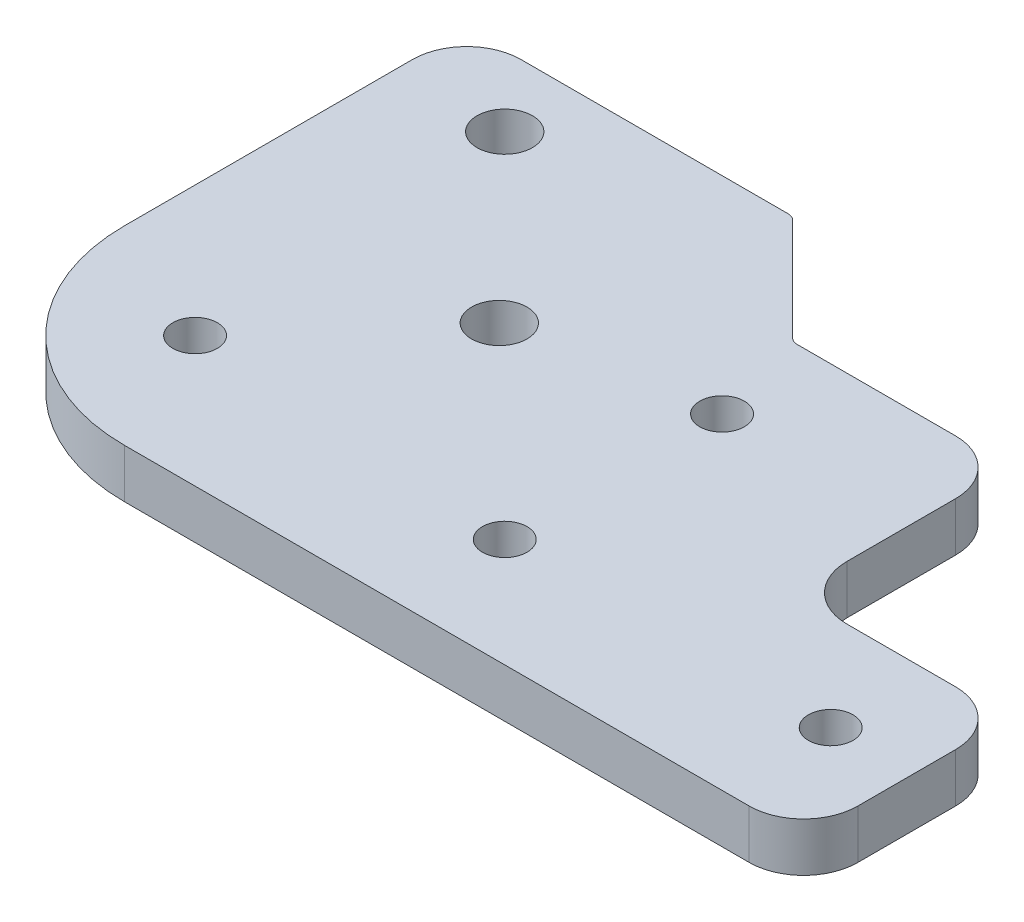
ISO-10303-21;
HEADER;
FILE_DESCRIPTION(('STEP AP214'),'2;1');
FILE_NAME('part.step','',(''),(''),'','','');
FILE_SCHEMA(('AUTOMOTIVE_DESIGN { 1 0 10303 214 1 1 1 1 }'));
ENDSEC;
DATA;
#1=APPLICATION_CONTEXT('core data for automotive mechanical design processes');
#2=APPLICATION_PROTOCOL_DEFINITION('international standard','automotive_design',2000,#1);
#3=PRODUCT_CONTEXT('',#1,'mechanical');
#4=PRODUCT('Part','Part','',(#3));
#5=PRODUCT_RELATED_PRODUCT_CATEGORY('part','',(#4));
#6=PRODUCT_DEFINITION_FORMATION('','',#4);
#7=PRODUCT_DEFINITION_CONTEXT('part definition',#1,'design');
#8=PRODUCT_DEFINITION('design','',#6,#7);
#9=PRODUCT_DEFINITION_SHAPE('','',#8);
#10=(LENGTH_UNIT() NAMED_UNIT(*) SI_UNIT(.MILLI.,.METRE.));
#11=(NAMED_UNIT(*) PLANE_ANGLE_UNIT() SI_UNIT($,.RADIAN.));
#12=(NAMED_UNIT(*) SI_UNIT($,.STERADIAN.) SOLID_ANGLE_UNIT());
#13=UNCERTAINTY_MEASURE_WITH_UNIT(LENGTH_MEASURE(1.E-05),#10,'distance_accuracy_value','');
#14=(GEOMETRIC_REPRESENTATION_CONTEXT(3) GLOBAL_UNCERTAINTY_ASSIGNED_CONTEXT((#13)) GLOBAL_UNIT_ASSIGNED_CONTEXT((#10,
#11,#12)) REPRESENTATION_CONTEXT('',''));
#15=CARTESIAN_POINT('',(0.,0.,0.));
#16=DIRECTION('',(0.,0.,1.));
#17=DIRECTION('',(1.,0.,0.));
#18=AXIS2_PLACEMENT_3D('',#15,#16,#17);
#19=CARTESIAN_POINT('',(0.,4.5,0.));
#20=DIRECTION('',(0.,-1.,0.));
#21=DIRECTION('',(0.,0.,-1.));
#22=AXIS2_PLACEMENT_3D('',#19,#20,#21);
#23=PLANE('',#22);
#24=CARTESIAN_POINT('',(25.,4.5,-27.));
#25=DIRECTION('',(0.,1.,0.));
#26=DIRECTION('',(0.,0.,1.));
#27=AXIS2_PLACEMENT_3D('',#24,#25,#26);
#28=CIRCLE('',#27,2.55);
#29=CARTESIAN_POINT('',(25.,4.5,-24.45));
#30=VERTEX_POINT('',#29);
#31=EDGE_CURVE('E548',#30,#30,#28,.T.);
#32=ORIENTED_EDGE('',*,*,#31,.F.);
#33=EDGE_LOOP('',(#32));
#34=FACE_BOUND('',#33,.T.);
#35=CARTESIAN_POINT('',(9.99999999999999,4.5,-42.5));
#36=DIRECTION('',(0.,1.,0.));
#37=DIRECTION('',(0.,0.,1.));
#38=AXIS2_PLACEMENT_3D('',#35,#36,#37);
#39=CIRCLE('',#38,2.55);
#40=CARTESIAN_POINT('',(9.99999999999999,4.5,-39.95));
#41=VERTEX_POINT('',#40);
#42=EDGE_CURVE('E554',#41,#41,#39,.T.);
#43=ORIENTED_EDGE('',*,*,#42,.F.);
#44=EDGE_LOOP('',(#43));
#45=FACE_BOUND('',#44,.T.);
#46=CARTESIAN_POINT('',(12.,4.5,-12.));
#47=DIRECTION('',(0.,1.,0.));
#48=DIRECTION('',(0.,0.,1.));
#49=AXIS2_PLACEMENT_3D('',#46,#47,#48);
#50=CIRCLE('',#49,2.05);
#51=CARTESIAN_POINT('',(12.,4.5,-9.95));
#52=VERTEX_POINT('',#51);
#53=EDGE_CURVE('E562',#52,#52,#50,.T.);
#54=ORIENTED_EDGE('',*,*,#53,.F.);
#55=EDGE_LOOP('',(#54));
#56=FACE_BOUND('',#55,.T.);
#57=DIRECTION('',(-0.707106781186548,0.,-0.707106781186548));
#58=VECTOR('',#57,1.);
#59=CARTESIAN_POINT('',(40.,4.5,-39.));
#60=LINE('',#59,#58);
#61=CARTESIAN_POINT('',(39.7071067811865,4.5,-39.2928932188134));
#62=VERTEX_POINT('',#61);
#63=CARTESIAN_POINT('',(30.2928932188134,4.5,-48.7071067811865));
#64=VERTEX_POINT('',#63);
#65=EDGE_CURVE('E264',#62,#64,#60,.T.);
#66=ORIENTED_EDGE('',*,*,#65,.T.);
#67=CARTESIAN_POINT('',(29.5857864376269,4.5,-48.));
#68=DIRECTION('',(0.,-1.,0.));
#69=DIRECTION('',(0.,0.,-1.));
#70=AXIS2_PLACEMENT_3D('',#67,#68,#69);
#71=CIRCLE('',#70,1.);
#72=CARTESIAN_POINT('',(29.5857864376269,4.5,-49.));
#73=VERTEX_POINT('',#72);
#74=EDGE_CURVE('E253',#64,#73,#71,.F.);
#75=ORIENTED_EDGE('',*,*,#74,.T.);
#76=DIRECTION('',(-1.,0.,0.));
#77=VECTOR('',#76,1.);
#78=CARTESIAN_POINT('',(0.,4.5,-49.));
#79=LINE('',#78,#77);
#80=CARTESIAN_POINT('',(4.99999999999999,4.5,-49.));
#81=VERTEX_POINT('',#80);
#82=EDGE_CURVE('E196',#73,#81,#79,.T.);
#83=ORIENTED_EDGE('',*,*,#82,.T.);
#84=CARTESIAN_POINT('',(4.99999999999999,4.5,-44.));
#85=DIRECTION('',(0.,-1.,0.));
#86=DIRECTION('',(0.,0.,-1.));
#87=AXIS2_PLACEMENT_3D('',#84,#85,#86);
#88=CIRCLE('',#87,5.);
#89=CARTESIAN_POINT('',(0.,4.5,-44.));
#90=VERTEX_POINT('',#89);
#91=EDGE_CURVE('E204',#81,#90,#88,.F.);
#92=ORIENTED_EDGE('',*,*,#91,.T.);
#93=DIRECTION('',(0.,0.,1.));
#94=VECTOR('',#93,1.);
#95=CARTESIAN_POINT('',(0.,4.5,0.));
#96=LINE('',#95,#94);
#97=CARTESIAN_POINT('',(0.,4.5,-17.5));
#98=VERTEX_POINT('',#97);
#99=EDGE_CURVE('E195',#90,#98,#96,.T.);
#100=ORIENTED_EDGE('',*,*,#99,.T.);
#101=CARTESIAN_POINT('',(17.5,4.5,-17.5));
#102=DIRECTION('',(0.,-1.,0.));
#103=DIRECTION('',(0.,0.,-1.));
#104=AXIS2_PLACEMENT_3D('',#101,#102,#103);
#105=CIRCLE('',#104,17.5);
#106=CARTESIAN_POINT('',(17.5,4.5,0.));
#107=VERTEX_POINT('',#106);
#108=EDGE_CURVE('E242',#98,#107,#105,.F.);
#109=ORIENTED_EDGE('',*,*,#108,.T.);
#110=DIRECTION('',(1.,0.,0.));
#111=VECTOR('',#110,1.);
#112=CARTESIAN_POINT('',(0.,4.5,0.));
#113=LINE('',#112,#111);
#114=CARTESIAN_POINT('',(75.,4.5,0.));
#115=VERTEX_POINT('',#114);
#116=EDGE_CURVE('E292',#107,#115,#113,.T.);
#117=ORIENTED_EDGE('',*,*,#116,.T.);
#118=CARTESIAN_POINT('',(75.,4.5,-5.));
#119=DIRECTION('',(0.,-1.,0.));
#120=DIRECTION('',(0.,0.,-1.));
#121=AXIS2_PLACEMENT_3D('',#118,#119,#120);
#122=CIRCLE('',#121,5.);
#123=CARTESIAN_POINT('',(80.,4.5,-5.));
#124=VERTEX_POINT('',#123);
#125=EDGE_CURVE('E210',#115,#124,#122,.F.);
#126=ORIENTED_EDGE('',*,*,#125,.T.);
#127=DIRECTION('',(0.,0.,-1.));
#128=VECTOR('',#127,1.);
#129=CARTESIAN_POINT('',(80.,4.5,0.));
#130=LINE('',#129,#128);
#131=CARTESIAN_POINT('',(80.,4.5,-14.));
#132=VERTEX_POINT('',#131);
#133=EDGE_CURVE('E169',#124,#132,#130,.T.);
#134=ORIENTED_EDGE('',*,*,#133,.T.);
#135=CARTESIAN_POINT('',(75.,4.5,-14.));
#136=DIRECTION('',(0.,-1.,0.));
#137=DIRECTION('',(0.,0.,-1.));
#138=AXIS2_PLACEMENT_3D('',#135,#136,#137);
#139=CIRCLE('',#138,5.);
#140=CARTESIAN_POINT('',(75.,4.5,-19.));
#141=VERTEX_POINT('',#140);
#142=EDGE_CURVE('E208',#132,#141,#139,.F.);
#143=ORIENTED_EDGE('',*,*,#142,.T.);
#144=DIRECTION('',(-1.,0.,0.));
#145=VECTOR('',#144,1.);
#146=CARTESIAN_POINT('',(80.,4.5,-19.));
#147=LINE('',#146,#145);
#148=CARTESIAN_POINT('',(65.,4.5,-19.));
#149=VERTEX_POINT('',#148);
#150=EDGE_CURVE('E295',#141,#149,#147,.T.);
#151=ORIENTED_EDGE('',*,*,#150,.T.);
#152=CARTESIAN_POINT('',(65.,4.5,-24.));
#153=DIRECTION('',(0.,-1.,0.));
#154=DIRECTION('',(0.,0.,-1.));
#155=AXIS2_PLACEMENT_3D('',#152,#153,#154);
#156=CIRCLE('',#155,5.);
#157=CARTESIAN_POINT('',(60.,4.5,-24.));
#158=VERTEX_POINT('',#157);
#159=EDGE_CURVE('E233',#149,#158,#156,.T.);
#160=ORIENTED_EDGE('',*,*,#159,.T.);
#161=DIRECTION('',(0.,0.,-1.));
#162=VECTOR('',#161,1.);
#163=CARTESIAN_POINT('',(60.,4.5,-19.));
#164=LINE('',#163,#162);
#165=CARTESIAN_POINT('',(60.,4.5,-34.));
#166=VERTEX_POINT('',#165);
#167=EDGE_CURVE('E270',#158,#166,#164,.T.);
#168=ORIENTED_EDGE('',*,*,#167,.T.);
#169=CARTESIAN_POINT('',(55.,4.5,-34.));
#170=DIRECTION('',(0.,-1.,0.));
#171=DIRECTION('',(0.,0.,-1.));
#172=AXIS2_PLACEMENT_3D('',#169,#170,#171);
#173=CIRCLE('',#172,5.);
#174=CARTESIAN_POINT('',(55.,4.5,-39.));
#175=VERTEX_POINT('',#174);
#176=EDGE_CURVE('E206',#166,#175,#173,.F.);
#177=ORIENTED_EDGE('',*,*,#176,.T.);
#178=DIRECTION('',(-1.,0.,0.));
#179=VECTOR('',#178,1.);
#180=CARTESIAN_POINT('',(60.,4.5,-39.));
#181=LINE('',#180,#179);
#182=CARTESIAN_POINT('',(40.4142135623731,4.5,-39.));
#183=VERTEX_POINT('',#182);
#184=EDGE_CURVE('E266',#175,#183,#181,.T.);
#185=ORIENTED_EDGE('',*,*,#184,.T.);
#186=CARTESIAN_POINT('',(40.4142135623731,4.5,-40.));
#187=DIRECTION('',(0.,-1.,0.));
#188=DIRECTION('',(0.,0.,-1.));
#189=AXIS2_PLACEMENT_3D('',#186,#187,#188);
#190=CIRCLE('',#189,1.);
#191=EDGE_CURVE('E11',#183,#62,#190,.T.);
#192=ORIENTED_EDGE('',*,*,#191,.T.);
#193=EDGE_LOOP('',(#66,#75,#83,#92,#100,#109,#117,#126,#134,#143,#151,#160,#168,#177,#185,#192));
#194=FACE_BOUND('',#193,.T.);
#195=CARTESIAN_POINT('',(72.5,4.5,-10.));
#196=DIRECTION('',(0.,1.,0.));
#197=DIRECTION('',(0.,0.,1.));
#198=AXIS2_PLACEMENT_3D('',#195,#196,#197);
#199=CIRCLE('',#198,2.04999999999999);
#200=CARTESIAN_POINT('',(72.5,4.5,-7.95000000000001));
#201=VERTEX_POINT('',#200);
#202=EDGE_CURVE('E274',#201,#201,#199,.T.);
#203=ORIENTED_EDGE('',*,*,#202,.F.);
#204=EDGE_LOOP('',(#203));
#205=FACE_BOUND('',#204,.T.);
#206=CARTESIAN_POINT('',(42.5,4.5,-10.));
#207=DIRECTION('',(0.,1.,0.));
#208=DIRECTION('',(0.,0.,1.));
#209=AXIS2_PLACEMENT_3D('',#206,#207,#208);
#210=CIRCLE('',#209,2.04999999999999);
#211=CARTESIAN_POINT('',(42.5,4.5,-7.95));
#212=VERTEX_POINT('',#211);
#213=EDGE_CURVE('E284',#212,#212,#210,.T.);
#214=ORIENTED_EDGE('',*,*,#213,.F.);
#215=EDGE_LOOP('',(#214));
#216=FACE_BOUND('',#215,.T.);
#217=CARTESIAN_POINT('',(42.5,4.5,-30.));
#218=DIRECTION('',(0.,1.,0.));
#219=DIRECTION('',(0.,0.,1.));
#220=AXIS2_PLACEMENT_3D('',#217,#218,#219);
#221=CIRCLE('',#220,2.05);
#222=CARTESIAN_POINT('',(42.5,4.5,-27.95));
#223=VERTEX_POINT('',#222);
#224=EDGE_CURVE('E565',#223,#223,#221,.T.);
#225=ORIENTED_EDGE('',*,*,#224,.F.);
#226=EDGE_LOOP('',(#225));
#227=FACE_BOUND('',#226,.T.);
#228=ADVANCED_FACE('F33',(#34,#45,#56,#194,#205,#216,#227),#23,.F.);
#229=CARTESIAN_POINT('',(0.,0.,0.));
#230=DIRECTION('',(0.,-1.,0.));
#231=DIRECTION('',(0.,0.,-1.));
#232=AXIS2_PLACEMENT_3D('',#229,#230,#231);
#233=PLANE('',#232);
#234=CARTESIAN_POINT('',(25.,0.,-27.));
#235=DIRECTION('',(0.,1.,0.));
#236=DIRECTION('',(0.,0.,1.));
#237=AXIS2_PLACEMENT_3D('',#234,#235,#236);
#238=CIRCLE('',#237,2.55);
#239=CARTESIAN_POINT('',(25.,0.,-24.45));
#240=VERTEX_POINT('',#239);
#241=EDGE_CURVE('E546',#240,#240,#238,.T.);
#242=ORIENTED_EDGE('',*,*,#241,.T.);
#243=EDGE_LOOP('',(#242));
#244=FACE_BOUND('',#243,.T.);
#245=CARTESIAN_POINT('',(9.99999999999999,0.,-42.5));
#246=DIRECTION('',(0.,1.,0.));
#247=DIRECTION('',(0.,0.,1.));
#248=AXIS2_PLACEMENT_3D('',#245,#246,#247);
#249=CIRCLE('',#248,2.55);
#250=CARTESIAN_POINT('',(9.99999999999999,0.,-39.95));
#251=VERTEX_POINT('',#250);
#252=EDGE_CURVE('E549',#251,#251,#249,.T.);
#253=ORIENTED_EDGE('',*,*,#252,.T.);
#254=EDGE_LOOP('',(#253));
#255=FACE_BOUND('',#254,.T.);
#256=CARTESIAN_POINT('',(12.,0.,-12.));
#257=DIRECTION('',(0.,1.,0.));
#258=DIRECTION('',(0.,0.,1.));
#259=AXIS2_PLACEMENT_3D('',#256,#257,#258);
#260=CIRCLE('',#259,2.05);
#261=CARTESIAN_POINT('',(12.,0.,-9.95));
#262=VERTEX_POINT('',#261);
#263=EDGE_CURVE('E559',#262,#262,#260,.T.);
#264=ORIENTED_EDGE('',*,*,#263,.T.);
#265=EDGE_LOOP('',(#264));
#266=FACE_BOUND('',#265,.T.);
#267=CARTESIAN_POINT('',(42.5,0.,-10.));
#268=DIRECTION('',(0.,1.,0.));
#269=DIRECTION('',(0.,0.,1.));
#270=AXIS2_PLACEMENT_3D('',#267,#268,#269);
#271=CIRCLE('',#270,2.04999999999999);
#272=CARTESIAN_POINT('',(42.5,0.,-7.95));
#273=VERTEX_POINT('',#272);
#274=EDGE_CURVE('E287',#273,#273,#271,.T.);
#275=ORIENTED_EDGE('',*,*,#274,.T.);
#276=EDGE_LOOP('',(#275));
#277=FACE_BOUND('',#276,.T.);
#278=DIRECTION('',(-1.,0.,0.));
#279=VECTOR('',#278,1.);
#280=CARTESIAN_POINT('',(0.,0.,-49.));
#281=LINE('',#280,#279);
#282=CARTESIAN_POINT('',(29.5857864376269,0.,-49.));
#283=VERTEX_POINT('',#282);
#284=CARTESIAN_POINT('',(4.99999999999999,0.,-49.));
#285=VERTEX_POINT('',#284);
#286=EDGE_CURVE('E193',#283,#285,#281,.T.);
#287=ORIENTED_EDGE('',*,*,#286,.F.);
#288=CARTESIAN_POINT('',(29.5857864376269,0.,-48.));
#289=DIRECTION('',(0.,-1.,0.));
#290=DIRECTION('',(0.,0.,-1.));
#291=AXIS2_PLACEMENT_3D('',#288,#289,#290);
#292=CIRCLE('',#291,1.);
#293=CARTESIAN_POINT('',(30.2928932188134,0.,-48.7071067811865));
#294=VERTEX_POINT('',#293);
#295=EDGE_CURVE('E247',#283,#294,#292,.T.);
#296=ORIENTED_EDGE('',*,*,#295,.T.);
#297=DIRECTION('',(-0.707106781186548,0.,-0.707106781186548));
#298=VECTOR('',#297,1.);
#299=CARTESIAN_POINT('',(40.,0.,-39.));
#300=LINE('',#299,#298);
#301=CARTESIAN_POINT('',(39.7071067811865,0.,-39.2928932188134));
#302=VERTEX_POINT('',#301);
#303=EDGE_CURVE('E191',#302,#294,#300,.T.);
#304=ORIENTED_EDGE('',*,*,#303,.F.);
#305=CARTESIAN_POINT('',(40.4142135623731,0.,-40.));
#306=DIRECTION('',(0.,-1.,0.));
#307=DIRECTION('',(0.,0.,-1.));
#308=AXIS2_PLACEMENT_3D('',#305,#306,#307);
#309=CIRCLE('',#308,1.);
#310=CARTESIAN_POINT('',(40.4142135623731,0.,-39.));
#311=VERTEX_POINT('',#310);
#312=EDGE_CURVE('E41',#302,#311,#309,.F.);
#313=ORIENTED_EDGE('',*,*,#312,.T.);
#314=DIRECTION('',(-1.,0.,0.));
#315=VECTOR('',#314,1.);
#316=CARTESIAN_POINT('',(60.,0.,-39.));
#317=LINE('',#316,#315);
#318=CARTESIAN_POINT('',(55.,0.,-39.));
#319=VERTEX_POINT('',#318);
#320=EDGE_CURVE('E189',#319,#311,#317,.T.);
#321=ORIENTED_EDGE('',*,*,#320,.F.);
#322=CARTESIAN_POINT('',(55.,0.,-34.));
#323=DIRECTION('',(0.,-1.,0.));
#324=DIRECTION('',(0.,0.,-1.));
#325=AXIS2_PLACEMENT_3D('',#322,#323,#324);
#326=CIRCLE('',#325,5.);
#327=CARTESIAN_POINT('',(60.,0.,-34.));
#328=VERTEX_POINT('',#327);
#329=EDGE_CURVE('E200',#319,#328,#326,.T.);
#330=ORIENTED_EDGE('',*,*,#329,.T.);
#331=DIRECTION('',(0.,0.,-1.));
#332=VECTOR('',#331,1.);
#333=CARTESIAN_POINT('',(60.,0.,-19.));
#334=LINE('',#333,#332);
#335=CARTESIAN_POINT('',(60.,0.,-24.));
#336=VERTEX_POINT('',#335);
#337=EDGE_CURVE('E181',#336,#328,#334,.T.);
#338=ORIENTED_EDGE('',*,*,#337,.F.);
#339=CARTESIAN_POINT('',(65.,0.,-24.));
#340=DIRECTION('',(0.,-1.,0.));
#341=DIRECTION('',(0.,0.,-1.));
#342=AXIS2_PLACEMENT_3D('',#339,#340,#341);
#343=CIRCLE('',#342,5.);
#344=CARTESIAN_POINT('',(65.,0.,-19.));
#345=VERTEX_POINT('',#344);
#346=EDGE_CURVE('E231',#336,#345,#343,.F.);
#347=ORIENTED_EDGE('',*,*,#346,.T.);
#348=DIRECTION('',(-1.,0.,0.));
#349=VECTOR('',#348,1.);
#350=CARTESIAN_POINT('',(80.,0.,-19.));
#351=LINE('',#350,#349);
#352=CARTESIAN_POINT('',(75.,0.,-19.));
#353=VERTEX_POINT('',#352);
#354=EDGE_CURVE('E177',#353,#345,#351,.T.);
#355=ORIENTED_EDGE('',*,*,#354,.F.);
#356=CARTESIAN_POINT('',(75.,0.,-14.));
#357=DIRECTION('',(0.,-1.,0.));
#358=DIRECTION('',(0.,0.,-1.));
#359=AXIS2_PLACEMENT_3D('',#356,#357,#358);
#360=CIRCLE('',#359,5.);
#361=CARTESIAN_POINT('',(80.,0.,-14.));
#362=VERTEX_POINT('',#361);
#363=EDGE_CURVE('E160',#353,#362,#360,.T.);
#364=ORIENTED_EDGE('',*,*,#363,.T.);
#365=DIRECTION('',(0.,0.,-1.));
#366=VECTOR('',#365,1.);
#367=CARTESIAN_POINT('',(80.,0.,0.));
#368=LINE('',#367,#366);
#369=CARTESIAN_POINT('',(80.,0.,-5.));
#370=VERTEX_POINT('',#369);
#371=EDGE_CURVE('E166',#370,#362,#368,.T.);
#372=ORIENTED_EDGE('',*,*,#371,.F.);
#373=CARTESIAN_POINT('',(75.,0.,-5.));
#374=DIRECTION('',(0.,-1.,0.));
#375=DIRECTION('',(0.,0.,-1.));
#376=AXIS2_PLACEMENT_3D('',#373,#374,#375);
#377=CIRCLE('',#376,5.);
#378=CARTESIAN_POINT('',(75.,0.,0.));
#379=VERTEX_POINT('',#378);
#380=EDGE_CURVE('E150',#370,#379,#377,.T.);
#381=ORIENTED_EDGE('',*,*,#380,.T.);
#382=DIRECTION('',(1.,0.,0.));
#383=VECTOR('',#382,1.);
#384=CARTESIAN_POINT('',(0.,0.,0.));
#385=LINE('',#384,#383);
#386=CARTESIAN_POINT('',(17.5,0.,0.));
#387=VERTEX_POINT('',#386);
#388=EDGE_CURVE('E178',#387,#379,#385,.T.);
#389=ORIENTED_EDGE('',*,*,#388,.F.);
#390=CARTESIAN_POINT('',(17.5,0.,-17.5));
#391=DIRECTION('',(0.,-1.,0.));
#392=DIRECTION('',(0.,0.,-1.));
#393=AXIS2_PLACEMENT_3D('',#390,#391,#392);
#394=CIRCLE('',#393,17.5);
#395=CARTESIAN_POINT('',(0.,0.,-17.5));
#396=VERTEX_POINT('',#395);
#397=EDGE_CURVE('E238',#387,#396,#394,.T.);
#398=ORIENTED_EDGE('',*,*,#397,.T.);
#399=DIRECTION('',(0.,0.,1.));
#400=VECTOR('',#399,1.);
#401=CARTESIAN_POINT('',(0.,0.,0.));
#402=LINE('',#401,#400);
#403=CARTESIAN_POINT('',(0.,0.,-44.));
#404=VERTEX_POINT('',#403);
#405=EDGE_CURVE('E183',#404,#396,#402,.T.);
#406=ORIENTED_EDGE('',*,*,#405,.F.);
#407=CARTESIAN_POINT('',(4.99999999999999,0.,-44.));
#408=DIRECTION('',(0.,-1.,0.));
#409=DIRECTION('',(0.,0.,-1.));
#410=AXIS2_PLACEMENT_3D('',#407,#408,#409);
#411=CIRCLE('',#410,5.);
#412=EDGE_CURVE('E170',#404,#285,#411,.T.);
#413=ORIENTED_EDGE('',*,*,#412,.T.);
#414=EDGE_LOOP('',(#287,#296,#304,#313,#321,#330,#338,#347,#355,#364,#372,#381,#389,#398,#406,#413));
#415=FACE_BOUND('',#414,.T.);
#416=CARTESIAN_POINT('',(72.5,0.,-10.));
#417=DIRECTION('',(0.,1.,0.));
#418=DIRECTION('',(0.,0.,1.));
#419=AXIS2_PLACEMENT_3D('',#416,#417,#418);
#420=CIRCLE('',#419,2.04999999999999);
#421=CARTESIAN_POINT('',(72.5,0.,-7.95000000000001));
#422=VERTEX_POINT('',#421);
#423=EDGE_CURVE('E279',#422,#422,#420,.T.);
#424=ORIENTED_EDGE('',*,*,#423,.T.);
#425=EDGE_LOOP('',(#424));
#426=FACE_BOUND('',#425,.T.);
#427=CARTESIAN_POINT('',(42.5,0.,-30.));
#428=DIRECTION('',(0.,1.,0.));
#429=DIRECTION('',(0.,0.,1.));
#430=AXIS2_PLACEMENT_3D('',#427,#428,#429);
#431=CIRCLE('',#430,2.05);
#432=CARTESIAN_POINT('',(42.5,0.,-27.95));
#433=VERTEX_POINT('',#432);
#434=EDGE_CURVE('E551',#433,#433,#431,.T.);
#435=ORIENTED_EDGE('',*,*,#434,.T.);
#436=EDGE_LOOP('',(#435));
#437=FACE_BOUND('',#436,.T.);
#438=ADVANCED_FACE('F174',(#244,#255,#266,#277,#415,#426,#437),#233,.T.);
#439=CARTESIAN_POINT('',(0.,4.5,0.));
#440=DIRECTION('',(1.,0.,0.));
#441=DIRECTION('',(0.,0.,-1.));
#442=AXIS2_PLACEMENT_3D('',#439,#440,#441);
#443=PLANE('',#442);
#444=ORIENTED_EDGE('',*,*,#405,.T.);
#445=DIRECTION('',(0.,-1.,0.));
#446=VECTOR('',#445,1.);
#447=CARTESIAN_POINT('',(0.,4.5,-17.5));
#448=LINE('',#447,#446);
#449=EDGE_CURVE('E240',#396,#98,#448,.F.);
#450=ORIENTED_EDGE('',*,*,#449,.T.);
#451=ORIENTED_EDGE('',*,*,#99,.F.);
#452=DIRECTION('',(0.,-1.,0.));
#453=VECTOR('',#452,1.);
#454=CARTESIAN_POINT('',(0.,4.5,-44.));
#455=LINE('',#454,#453);
#456=EDGE_CURVE('E225',#90,#404,#455,.T.);
#457=ORIENTED_EDGE('',*,*,#456,.T.);
#458=EDGE_LOOP('',(#444,#450,#451,#457));
#459=FACE_BOUND('',#458,.T.);
#460=ADVANCED_FACE('F326',(#459),#443,.F.);
#461=CARTESIAN_POINT('',(0.,4.5,0.));
#462=DIRECTION('',(0.,0.,-1.));
#463=DIRECTION('',(-1.,0.,0.));
#464=AXIS2_PLACEMENT_3D('',#461,#462,#463);
#465=PLANE('',#464);
#466=ORIENTED_EDGE('',*,*,#116,.F.);
#467=DIRECTION('',(0.,-1.,0.));
#468=VECTOR('',#467,1.);
#469=CARTESIAN_POINT('',(17.5,4.5,0.));
#470=LINE('',#469,#468);
#471=EDGE_CURVE('E235',#107,#387,#470,.T.);
#472=ORIENTED_EDGE('',*,*,#471,.T.);
#473=ORIENTED_EDGE('',*,*,#388,.T.);
#474=DIRECTION('',(0.,-1.,0.));
#475=VECTOR('',#474,1.);
#476=CARTESIAN_POINT('',(75.,4.5,0.));
#477=LINE('',#476,#475);
#478=EDGE_CURVE('E156',#379,#115,#477,.F.);
#479=ORIENTED_EDGE('',*,*,#478,.T.);
#480=EDGE_LOOP('',(#466,#472,#473,#479));
#481=FACE_BOUND('',#480,.T.);
#482=ADVANCED_FACE('F322',(#481),#465,.F.);
#483=CARTESIAN_POINT('',(80.,4.5,0.));
#484=DIRECTION('',(-1.,0.,0.));
#485=DIRECTION('',(0.,0.,1.));
#486=AXIS2_PLACEMENT_3D('',#483,#484,#485);
#487=PLANE('',#486);
#488=ORIENTED_EDGE('',*,*,#133,.F.);
#489=DIRECTION('',(0.,-1.,0.));
#490=VECTOR('',#489,1.);
#491=CARTESIAN_POINT('',(80.,4.5,-5.));
#492=LINE('',#491,#490);
#493=EDGE_CURVE('E154',#124,#370,#492,.T.);
#494=ORIENTED_EDGE('',*,*,#493,.T.);
#495=ORIENTED_EDGE('',*,*,#371,.T.);
#496=DIRECTION('',(0.,-1.,0.));
#497=VECTOR('',#496,1.);
#498=CARTESIAN_POINT('',(80.,4.5,-14.));
#499=LINE('',#498,#497);
#500=EDGE_CURVE('E171',#362,#132,#499,.F.);
#501=ORIENTED_EDGE('',*,*,#500,.T.);
#502=EDGE_LOOP('',(#488,#494,#495,#501));
#503=FACE_BOUND('',#502,.T.);
#504=ADVANCED_FACE('F165',(#503),#487,.F.);
#505=CARTESIAN_POINT('',(80.,4.5,-19.));
#506=DIRECTION('',(0.,0.,1.));
#507=DIRECTION('',(1.,0.,0.));
#508=AXIS2_PLACEMENT_3D('',#505,#506,#507);
#509=PLANE('',#508);
#510=ORIENTED_EDGE('',*,*,#150,.F.);
#511=DIRECTION('',(0.,-1.,0.));
#512=VECTOR('',#511,1.);
#513=CARTESIAN_POINT('',(75.,4.5,-19.));
#514=LINE('',#513,#512);
#515=EDGE_CURVE('E214',#141,#353,#514,.T.);
#516=ORIENTED_EDGE('',*,*,#515,.T.);
#517=ORIENTED_EDGE('',*,*,#354,.T.);
#518=DIRECTION('',(0.,-1.,0.));
#519=VECTOR('',#518,1.);
#520=CARTESIAN_POINT('',(65.,4.5,-19.));
#521=LINE('',#520,#519);
#522=EDGE_CURVE('E212',#345,#149,#521,.F.);
#523=ORIENTED_EDGE('',*,*,#522,.T.);
#524=EDGE_LOOP('',(#510,#516,#517,#523));
#525=FACE_BOUND('',#524,.T.);
#526=ADVANCED_FACE('F313',(#525),#509,.F.);
#527=CARTESIAN_POINT('',(60.,4.5,-19.));
#528=DIRECTION('',(-1.,0.,0.));
#529=DIRECTION('',(0.,0.,1.));
#530=AXIS2_PLACEMENT_3D('',#527,#528,#529);
#531=PLANE('',#530);
#532=ORIENTED_EDGE('',*,*,#167,.F.);
#533=DIRECTION('',(0.,-1.,0.));
#534=VECTOR('',#533,1.);
#535=CARTESIAN_POINT('',(60.,0.,-24.));
#536=LINE('',#535,#534);
#537=EDGE_CURVE('E219',#158,#336,#536,.T.);
#538=ORIENTED_EDGE('',*,*,#537,.T.);
#539=ORIENTED_EDGE('',*,*,#337,.T.);
#540=DIRECTION('',(0.,-1.,0.));
#541=VECTOR('',#540,1.);
#542=CARTESIAN_POINT('',(60.,4.5,-34.));
#543=LINE('',#542,#541);
#544=EDGE_CURVE('E217',#328,#166,#543,.F.);
#545=ORIENTED_EDGE('',*,*,#544,.T.);
#546=EDGE_LOOP('',(#532,#538,#539,#545));
#547=FACE_BOUND('',#546,.T.);
#548=ADVANCED_FACE('F307',(#547),#531,.F.);
#549=CARTESIAN_POINT('',(60.,4.5,-39.));
#550=DIRECTION('',(0.,0.,1.));
#551=DIRECTION('',(1.,0.,0.));
#552=AXIS2_PLACEMENT_3D('',#549,#550,#551);
#553=PLANE('',#552);
#554=ORIENTED_EDGE('',*,*,#320,.T.);
#555=DIRECTION('',(0.,-1.,0.));
#556=VECTOR('',#555,1.);
#557=CARTESIAN_POINT('',(40.4142135623731,4.5,-39.));
#558=LINE('',#557,#556);
#559=EDGE_CURVE('E48',#311,#183,#558,.F.);
#560=ORIENTED_EDGE('',*,*,#559,.T.);
#561=ORIENTED_EDGE('',*,*,#184,.F.);
#562=DIRECTION('',(0.,-1.,0.));
#563=VECTOR('',#562,1.);
#564=CARTESIAN_POINT('',(55.,4.5,-39.));
#565=LINE('',#564,#563);
#566=EDGE_CURVE('E222',#175,#319,#565,.T.);
#567=ORIENTED_EDGE('',*,*,#566,.T.);
#568=EDGE_LOOP('',(#554,#560,#561,#567));
#569=FACE_BOUND('',#568,.T.);
#570=ADVANCED_FACE('F259',(#569),#553,.F.);
#571=CARTESIAN_POINT('',(40.,4.5,-39.));
#572=DIRECTION('',(-0.707106781186547,0.,0.707106781186547));
#573=DIRECTION('',(0.707106781186548,0.,0.707106781186548));
#574=AXIS2_PLACEMENT_3D('',#571,#572,#573);
#575=PLANE('',#574);
#576=ORIENTED_EDGE('',*,*,#303,.T.);
#577=DIRECTION('',(0.,-1.,0.));
#578=VECTOR('',#577,1.);
#579=CARTESIAN_POINT('',(30.2928932188134,4.5,-48.7071067811865));
#580=LINE('',#579,#578);
#581=EDGE_CURVE('E56',#294,#64,#580,.F.);
#582=ORIENTED_EDGE('',*,*,#581,.T.);
#583=ORIENTED_EDGE('',*,*,#65,.F.);
#584=DIRECTION('',(0.,-1.,0.));
#585=VECTOR('',#584,1.);
#586=CARTESIAN_POINT('',(39.7071067811865,0.,-39.2928932188134));
#587=LINE('',#586,#585);
#588=EDGE_CURVE('E249',#62,#302,#587,.T.);
#589=ORIENTED_EDGE('',*,*,#588,.T.);
#590=EDGE_LOOP('',(#576,#582,#583,#589));
#591=FACE_BOUND('',#590,.T.);
#592=ADVANCED_FACE('F267',(#591),#575,.F.);
#593=CARTESIAN_POINT('',(0.,4.5,-49.));
#594=DIRECTION('',(0.,0.,1.));
#595=DIRECTION('',(1.,0.,0.));
#596=AXIS2_PLACEMENT_3D('',#593,#594,#595);
#597=PLANE('',#596);
#598=ORIENTED_EDGE('',*,*,#82,.F.);
#599=DIRECTION('',(0.,-1.,0.));
#600=VECTOR('',#599,1.);
#601=CARTESIAN_POINT('',(29.5857864376269,4.5,-49.));
#602=LINE('',#601,#600);
#603=EDGE_CURVE('E244',#73,#283,#602,.T.);
#604=ORIENTED_EDGE('',*,*,#603,.T.);
#605=ORIENTED_EDGE('',*,*,#286,.T.);
#606=DIRECTION('',(0.,-1.,0.));
#607=VECTOR('',#606,1.);
#608=CARTESIAN_POINT('',(4.99999999999999,4.5,-49.));
#609=LINE('',#608,#607);
#610=EDGE_CURVE('E228',#285,#81,#609,.F.);
#611=ORIENTED_EDGE('',*,*,#610,.T.);
#612=EDGE_LOOP('',(#598,#604,#605,#611));
#613=FACE_BOUND('',#612,.T.);
#614=ADVANCED_FACE('F334',(#613),#597,.F.);
#615=CARTESIAN_POINT('',(72.5,4.5,-10.));
#616=DIRECTION('',(0.,-1.,0.));
#617=DIRECTION('',(0.,0.,-1.));
#618=AXIS2_PLACEMENT_3D('',#615,#616,#617);
#619=CYLINDRICAL_SURFACE('',#618,2.04999999999999);
#620=ORIENTED_EDGE('',*,*,#202,.T.);
#621=EDGE_LOOP('',(#620));
#622=FACE_BOUND('',#621,.T.);
#623=ORIENTED_EDGE('',*,*,#423,.F.);
#624=EDGE_LOOP('',(#623));
#625=FACE_BOUND('',#624,.T.);
#626=ADVANCED_FACE('F356',(#622,#625),#619,.F.);
#627=CARTESIAN_POINT('',(42.5,4.5,-10.));
#628=DIRECTION('',(0.,-1.,0.));
#629=DIRECTION('',(0.,0.,-1.));
#630=AXIS2_PLACEMENT_3D('',#627,#628,#629);
#631=CYLINDRICAL_SURFACE('',#630,2.04999999999999);
#632=ORIENTED_EDGE('',*,*,#213,.T.);
#633=EDGE_LOOP('',(#632));
#634=FACE_BOUND('',#633,.T.);
#635=ORIENTED_EDGE('',*,*,#274,.F.);
#636=EDGE_LOOP('',(#635));
#637=FACE_BOUND('',#636,.T.);
#638=ADVANCED_FACE('F447',(#634,#637),#631,.F.);
#639=CARTESIAN_POINT('',(42.5,4.5,-30.));
#640=DIRECTION('',(0.,-1.,0.));
#641=DIRECTION('',(0.,0.,-1.));
#642=AXIS2_PLACEMENT_3D('',#639,#640,#641);
#643=CYLINDRICAL_SURFACE('',#642,2.05);
#644=ORIENTED_EDGE('',*,*,#224,.T.);
#645=EDGE_LOOP('',(#644));
#646=FACE_BOUND('',#645,.T.);
#647=ORIENTED_EDGE('',*,*,#434,.F.);
#648=EDGE_LOOP('',(#647));
#649=FACE_BOUND('',#648,.T.);
#650=ADVANCED_FACE('F452',(#646,#649),#643,.F.);
#651=CARTESIAN_POINT('',(12.,0.,-12.));
#652=DIRECTION('',(0.,1.,0.));
#653=DIRECTION('',(0.,0.,1.));
#654=AXIS2_PLACEMENT_3D('',#651,#652,#653);
#655=CYLINDRICAL_SURFACE('',#654,2.05);
#656=ORIENTED_EDGE('',*,*,#263,.F.);
#657=EDGE_LOOP('',(#656));
#658=FACE_BOUND('',#657,.T.);
#659=ORIENTED_EDGE('',*,*,#53,.T.);
#660=EDGE_LOOP('',(#659));
#661=FACE_BOUND('',#660,.T.);
#662=ADVANCED_FACE('F459',(#658,#661),#655,.F.);
#663=CARTESIAN_POINT('',(9.99999999999999,0.,-42.5));
#664=DIRECTION('',(0.,1.,0.));
#665=DIRECTION('',(0.,0.,1.));
#666=AXIS2_PLACEMENT_3D('',#663,#664,#665);
#667=CYLINDRICAL_SURFACE('',#666,2.55);
#668=ORIENTED_EDGE('',*,*,#252,.F.);
#669=EDGE_LOOP('',(#668));
#670=FACE_BOUND('',#669,.T.);
#671=ORIENTED_EDGE('',*,*,#42,.T.);
#672=EDGE_LOOP('',(#671));
#673=FACE_BOUND('',#672,.T.);
#674=ADVANCED_FACE('F467',(#670,#673),#667,.F.);
#675=CARTESIAN_POINT('',(25.,0.,-27.));
#676=DIRECTION('',(0.,1.,0.));
#677=DIRECTION('',(0.,0.,1.));
#678=AXIS2_PLACEMENT_3D('',#675,#676,#677);
#679=CYLINDRICAL_SURFACE('',#678,2.55);
#680=ORIENTED_EDGE('',*,*,#241,.F.);
#681=EDGE_LOOP('',(#680));
#682=FACE_BOUND('',#681,.T.);
#683=ORIENTED_EDGE('',*,*,#31,.T.);
#684=EDGE_LOOP('',(#683));
#685=FACE_BOUND('',#684,.T.);
#686=ADVANCED_FACE('F377',(#682,#685),#679,.F.);
#687=CARTESIAN_POINT('',(75.,4.5,-5.));
#688=DIRECTION('',(0.,-1.,0.));
#689=DIRECTION('',(0.,0.,-1.));
#690=AXIS2_PLACEMENT_3D('',#687,#688,#689);
#691=CYLINDRICAL_SURFACE('',#690,5.);
#692=ORIENTED_EDGE('',*,*,#125,.F.);
#693=ORIENTED_EDGE('',*,*,#478,.F.);
#694=ORIENTED_EDGE('',*,*,#380,.F.);
#695=ORIENTED_EDGE('',*,*,#493,.F.);
#696=EDGE_LOOP('',(#692,#693,#694,#695));
#697=FACE_BOUND('',#696,.T.);
#698=ADVANCED_FACE('F153',(#697),#691,.T.);
#699=CARTESIAN_POINT('',(75.,4.5,-14.));
#700=DIRECTION('',(0.,-1.,0.));
#701=DIRECTION('',(0.,0.,-1.));
#702=AXIS2_PLACEMENT_3D('',#699,#700,#701);
#703=CYLINDRICAL_SURFACE('',#702,5.);
#704=ORIENTED_EDGE('',*,*,#142,.F.);
#705=ORIENTED_EDGE('',*,*,#500,.F.);
#706=ORIENTED_EDGE('',*,*,#363,.F.);
#707=ORIENTED_EDGE('',*,*,#515,.F.);
#708=EDGE_LOOP('',(#704,#705,#706,#707));
#709=FACE_BOUND('',#708,.T.);
#710=ADVANCED_FACE('F317',(#709),#703,.T.);
#711=CARTESIAN_POINT('',(65.,4.5,-24.));
#712=DIRECTION('',(0.,1.,0.));
#713=DIRECTION('',(0.,0.,1.));
#714=AXIS2_PLACEMENT_3D('',#711,#712,#713);
#715=CYLINDRICAL_SURFACE('',#714,5.);
#716=ORIENTED_EDGE('',*,*,#159,.F.);
#717=ORIENTED_EDGE('',*,*,#522,.F.);
#718=ORIENTED_EDGE('',*,*,#346,.F.);
#719=ORIENTED_EDGE('',*,*,#537,.F.);
#720=EDGE_LOOP('',(#716,#717,#718,#719));
#721=FACE_BOUND('',#720,.T.);
#722=ADVANCED_FACE('F309',(#721),#715,.F.);
#723=CARTESIAN_POINT('',(55.,4.5,-34.));
#724=DIRECTION('',(0.,-1.,0.));
#725=DIRECTION('',(0.,0.,-1.));
#726=AXIS2_PLACEMENT_3D('',#723,#724,#725);
#727=CYLINDRICAL_SURFACE('',#726,5.);
#728=ORIENTED_EDGE('',*,*,#176,.F.);
#729=ORIENTED_EDGE('',*,*,#544,.F.);
#730=ORIENTED_EDGE('',*,*,#329,.F.);
#731=ORIENTED_EDGE('',*,*,#566,.F.);
#732=EDGE_LOOP('',(#728,#729,#730,#731));
#733=FACE_BOUND('',#732,.T.);
#734=ADVANCED_FACE('F305',(#733),#727,.T.);
#735=CARTESIAN_POINT('',(4.99999999999999,4.5,-44.));
#736=DIRECTION('',(0.,-1.,0.));
#737=DIRECTION('',(0.,0.,-1.));
#738=AXIS2_PLACEMENT_3D('',#735,#736,#737);
#739=CYLINDRICAL_SURFACE('',#738,5.);
#740=ORIENTED_EDGE('',*,*,#91,.F.);
#741=ORIENTED_EDGE('',*,*,#610,.F.);
#742=ORIENTED_EDGE('',*,*,#412,.F.);
#743=ORIENTED_EDGE('',*,*,#456,.F.);
#744=EDGE_LOOP('',(#740,#741,#742,#743));
#745=FACE_BOUND('',#744,.T.);
#746=ADVANCED_FACE('F332',(#745),#739,.T.);
#747=CARTESIAN_POINT('',(17.5,4.5,-17.5));
#748=DIRECTION('',(0.,-1.,0.));
#749=DIRECTION('',(0.,0.,-1.));
#750=AXIS2_PLACEMENT_3D('',#747,#748,#749);
#751=CYLINDRICAL_SURFACE('',#750,17.5);
#752=ORIENTED_EDGE('',*,*,#108,.F.);
#753=ORIENTED_EDGE('',*,*,#449,.F.);
#754=ORIENTED_EDGE('',*,*,#397,.F.);
#755=ORIENTED_EDGE('',*,*,#471,.F.);
#756=EDGE_LOOP('',(#752,#753,#754,#755));
#757=FACE_BOUND('',#756,.T.);
#758=ADVANCED_FACE('F324',(#757),#751,.T.);
#759=CARTESIAN_POINT('',(29.5857864376269,4.5,-48.));
#760=DIRECTION('',(0.,-1.,0.));
#761=DIRECTION('',(0.,0.,-1.));
#762=AXIS2_PLACEMENT_3D('',#759,#760,#761);
#763=CYLINDRICAL_SURFACE('',#762,1.);
#764=ORIENTED_EDGE('',*,*,#74,.F.);
#765=ORIENTED_EDGE('',*,*,#581,.F.);
#766=ORIENTED_EDGE('',*,*,#295,.F.);
#767=ORIENTED_EDGE('',*,*,#603,.F.);
#768=EDGE_LOOP('',(#764,#765,#766,#767));
#769=FACE_BOUND('',#768,.T.);
#770=ADVANCED_FACE('F337',(#769),#763,.T.);
#771=CARTESIAN_POINT('',(40.4142135623731,4.5,-40.));
#772=DIRECTION('',(0.,1.,0.));
#773=DIRECTION('',(0.,0.,1.));
#774=AXIS2_PLACEMENT_3D('',#771,#772,#773);
#775=CYLINDRICAL_SURFACE('',#774,1.);
#776=ORIENTED_EDGE('',*,*,#191,.F.);
#777=ORIENTED_EDGE('',*,*,#559,.F.);
#778=ORIENTED_EDGE('',*,*,#312,.F.);
#779=ORIENTED_EDGE('',*,*,#588,.F.);
#780=EDGE_LOOP('',(#776,#777,#778,#779));
#781=FACE_BOUND('',#780,.T.);
#782=ADVANCED_FACE('F35',(#781),#775,.F.);
#783=CLOSED_SHELL('',(#228,#438,#460,#482,#504,#526,#548,#570,#592,#614,#626,#638,#650,#662,
#674,#686,#698,#710,#722,#734,#746,#758,#770,#782));
#784=MANIFOLD_SOLID_BREP('B2',#783);
#785=ADVANCED_BREP_SHAPE_REPRESENTATION('',(#18,#784),#14);
#786=SHAPE_DEFINITION_REPRESENTATION(#9,#785);
ENDSEC;
END-ISO-10303-21;
